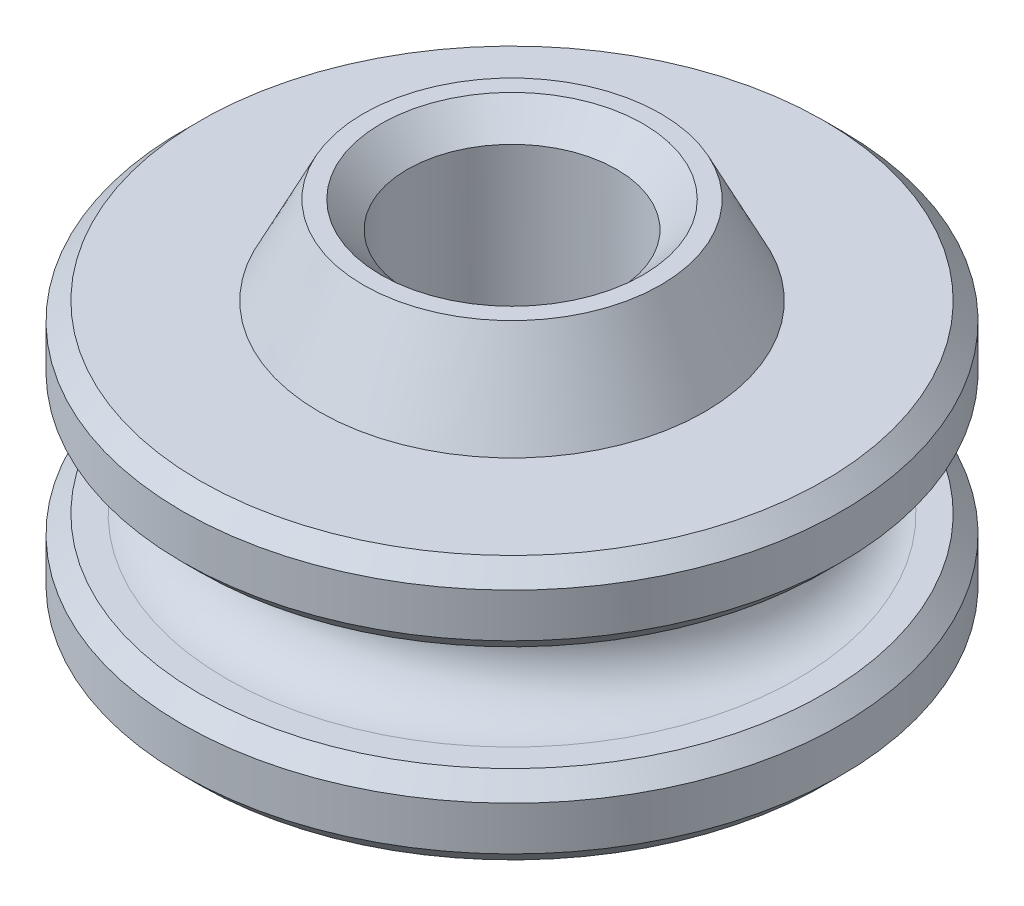
ISO-10303-21;
HEADER;
FILE_DESCRIPTION(('STEP AP214'),'2;1');
FILE_NAME('part.step','',(''),(''),'','','');
FILE_SCHEMA(('AUTOMOTIVE_DESIGN { 1 0 10303 214 1 1 1 1 }'));
ENDSEC;
DATA;
#1=APPLICATION_CONTEXT('core data for automotive mechanical design processes');
#2=APPLICATION_PROTOCOL_DEFINITION('international standard','automotive_design',2000,#1);
#3=PRODUCT_CONTEXT('',#1,'mechanical');
#4=PRODUCT('Part','Part','',(#3));
#5=PRODUCT_RELATED_PRODUCT_CATEGORY('part','',(#4));
#6=PRODUCT_DEFINITION_FORMATION('','',#4);
#7=PRODUCT_DEFINITION_CONTEXT('part definition',#1,'design');
#8=PRODUCT_DEFINITION('design','',#6,#7);
#9=PRODUCT_DEFINITION_SHAPE('','',#8);
#10=(LENGTH_UNIT() NAMED_UNIT(*) SI_UNIT(.MILLI.,.METRE.));
#11=(NAMED_UNIT(*) PLANE_ANGLE_UNIT() SI_UNIT($,.RADIAN.));
#12=(NAMED_UNIT(*) SI_UNIT($,.STERADIAN.) SOLID_ANGLE_UNIT());
#13=UNCERTAINTY_MEASURE_WITH_UNIT(LENGTH_MEASURE(1.E-05),#10,'distance_accuracy_value','');
#14=(GEOMETRIC_REPRESENTATION_CONTEXT(3) GLOBAL_UNCERTAINTY_ASSIGNED_CONTEXT((#13)) GLOBAL_UNIT_ASSIGNED_CONTEXT((#10,
#11,#12)) REPRESENTATION_CONTEXT('',''));
#15=CARTESIAN_POINT('',(0.,0.,0.));
#16=DIRECTION('',(0.,0.,1.));
#17=DIRECTION('',(1.,0.,0.));
#18=AXIS2_PLACEMENT_3D('',#15,#16,#17);
#19=CARTESIAN_POINT('',(0.,0.,0.));
#20=DIRECTION('',(0.,1.,0.));
#21=DIRECTION('',(0.,0.,1.));
#22=AXIS2_PLACEMENT_3D('',#19,#20,#21);
#23=TOROIDAL_SURFACE('',#22,3.25,0.6);
#24=CARTESIAN_POINT('',(0.,0.6,0.));
#25=DIRECTION('',(0.,1.,0.));
#26=DIRECTION('',(0.,0.,1.));
#27=AXIS2_PLACEMENT_3D('',#24,#25,#26);
#28=CIRCLE('',#27,3.25);
#29=CARTESIAN_POINT('',(0.,0.6,3.25));
#30=VERTEX_POINT('',#29);
#31=EDGE_CURVE('E78',#30,#30,#28,.T.);
#32=ORIENTED_EDGE('',*,*,#31,.F.);
#33=EDGE_LOOP('',(#32));
#34=FACE_BOUND('',#33,.T.);
#35=CARTESIAN_POINT('',(0.,-0.6,0.));
#36=DIRECTION('',(0.,1.,0.));
#37=DIRECTION('',(0.,0.,1.));
#38=AXIS2_PLACEMENT_3D('',#35,#36,#37);
#39=CIRCLE('',#38,3.25);
#40=CARTESIAN_POINT('',(0.,-0.6,3.25));
#41=VERTEX_POINT('',#40);
#42=EDGE_CURVE('E87',#41,#41,#39,.T.);
#43=ORIENTED_EDGE('',*,*,#42,.T.);
#44=EDGE_LOOP('',(#43));
#45=FACE_BOUND('',#44,.T.);
#46=ADVANCED_FACE('F34',(#34,#45),#23,.F.);
#47=CARTESIAN_POINT('',(0.,0.6,-3.25));
#48=DIRECTION('',(0.,1.,0.));
#49=DIRECTION('',(0.,0.,1.));
#50=AXIS2_PLACEMENT_3D('',#47,#48,#49);
#51=PLANE('',#50);
#52=CARTESIAN_POINT('',(0.,0.6,0.));
#53=DIRECTION('',(0.,1.,0.));
#54=DIRECTION('',(0.,0.,1.));
#55=AXIS2_PLACEMENT_3D('',#52,#53,#54);
#56=CIRCLE('',#55,3.55);
#57=CARTESIAN_POINT('',(0.,0.6,3.55));
#58=VERTEX_POINT('',#57);
#59=EDGE_CURVE('E45',#58,#58,#56,.F.);
#60=ORIENTED_EDGE('',*,*,#59,.T.);
#61=EDGE_LOOP('',(#60));
#62=FACE_BOUND('',#61,.T.);
#63=ORIENTED_EDGE('',*,*,#31,.T.);
#64=EDGE_LOOP('',(#63));
#65=FACE_BOUND('',#64,.T.);
#66=ADVANCED_FACE('F109',(#62,#65),#51,.F.);
#67=CARTESIAN_POINT('',(0.,2.7,0.));
#68=DIRECTION('',(0.,1.,0.));
#69=DIRECTION('',(0.,0.,1.));
#70=AXIS2_PLACEMENT_3D('',#67,#68,#69);
#71=CYLINDRICAL_SURFACE('',#70,3.75);
#72=CARTESIAN_POINT('',(0.,0.8,0.));
#73=DIRECTION('',(0.,1.,0.));
#74=DIRECTION('',(0.,0.,1.));
#75=AXIS2_PLACEMENT_3D('',#72,#73,#74);
#76=CIRCLE('',#75,3.75);
#77=CARTESIAN_POINT('',(0.,0.8,3.75));
#78=VERTEX_POINT('',#77);
#79=EDGE_CURVE('E49',#78,#78,#76,.T.);
#80=ORIENTED_EDGE('',*,*,#79,.T.);
#81=EDGE_LOOP('',(#80));
#82=FACE_BOUND('',#81,.T.);
#83=CARTESIAN_POINT('',(0.,1.3,0.));
#84=DIRECTION('',(0.,-1.,0.));
#85=DIRECTION('',(0.,0.,-1.));
#86=AXIS2_PLACEMENT_3D('',#83,#84,#85);
#87=CIRCLE('',#86,3.75);
#88=CARTESIAN_POINT('',(0.,1.3,-3.75));
#89=VERTEX_POINT('',#88);
#90=EDGE_CURVE('E54',#89,#89,#87,.T.);
#91=ORIENTED_EDGE('',*,*,#90,.T.);
#92=EDGE_LOOP('',(#91));
#93=FACE_BOUND('',#92,.T.);
#94=ADVANCED_FACE('F115',(#82,#93),#71,.T.);
#95=CARTESIAN_POINT('',(0.,1.5,-2.191));
#96=DIRECTION('',(0.,-1.,0.));
#97=DIRECTION('',(0.,0.,-1.));
#98=AXIS2_PLACEMENT_3D('',#95,#96,#97);
#99=PLANE('',#98);
#100=CARTESIAN_POINT('',(0.,1.5,0.));
#101=DIRECTION('',(0.,-1.,0.));
#102=DIRECTION('',(0.,0.,-1.));
#103=AXIS2_PLACEMENT_3D('',#100,#101,#102);
#104=CIRCLE('',#103,3.55);
#105=CARTESIAN_POINT('',(0.,1.5,-3.55));
#106=VERTEX_POINT('',#105);
#107=EDGE_CURVE('E41',#106,#106,#104,.F.);
#108=ORIENTED_EDGE('',*,*,#107,.T.);
#109=EDGE_LOOP('',(#108));
#110=FACE_BOUND('',#109,.T.);
#111=CARTESIAN_POINT('',(0.,1.5,0.));
#112=DIRECTION('',(0.,1.,0.));
#113=DIRECTION('',(0.,0.,1.));
#114=AXIS2_PLACEMENT_3D('',#111,#112,#113);
#115=CIRCLE('',#114,2.191);
#116=CARTESIAN_POINT('',(0.,1.5,2.191));
#117=VERTEX_POINT('',#116);
#118=EDGE_CURVE('E81',#117,#117,#115,.T.);
#119=ORIENTED_EDGE('',*,*,#118,.F.);
#120=EDGE_LOOP('',(#119));
#121=FACE_BOUND('',#120,.T.);
#122=ADVANCED_FACE('F142',(#110,#121),#99,.F.);
#123=CARTESIAN_POINT('',(0.,1.5,0.));
#124=DIRECTION('',(0.,-1.,0.));
#125=DIRECTION('',(0.,0.,-1.));
#126=AXIS2_PLACEMENT_3D('',#123,#124,#125);
#127=CONICAL_SURFACE('',#126,2.191,0.463647609000807);
#128=CARTESIAN_POINT('',(0.,2.5,0.));
#129=DIRECTION('',(0.,1.,0.));
#130=DIRECTION('',(0.,0.,1.));
#131=AXIS2_PLACEMENT_3D('',#128,#129,#130);
#132=CIRCLE('',#131,1.691);
#133=CARTESIAN_POINT('',(0.,2.5,1.691));
#134=VERTEX_POINT('',#133);
#135=EDGE_CURVE('E84',#134,#134,#132,.T.);
#136=ORIENTED_EDGE('',*,*,#135,.F.);
#137=EDGE_LOOP('',(#136));
#138=FACE_BOUND('',#137,.T.);
#139=ORIENTED_EDGE('',*,*,#118,.T.);
#140=EDGE_LOOP('',(#139));
#141=FACE_BOUND('',#140,.T.);
#142=ADVANCED_FACE('F147',(#138,#141),#127,.T.);
#143=CARTESIAN_POINT('',(0.,2.5,-1.191));
#144=DIRECTION('',(0.,-1.,0.));
#145=DIRECTION('',(0.,0.,-1.));
#146=AXIS2_PLACEMENT_3D('',#143,#144,#145);
#147=PLANE('',#146);
#148=CARTESIAN_POINT('',(0.,2.5,0.));
#149=DIRECTION('',(0.,-1.,0.));
#150=DIRECTION('',(0.,0.,-1.));
#151=AXIS2_PLACEMENT_3D('',#148,#149,#150);
#152=CIRCLE('',#151,1.491);
#153=CARTESIAN_POINT('',(0.,2.5,-1.491));
#154=VERTEX_POINT('',#153);
#155=EDGE_CURVE('E69',#154,#154,#152,.T.);
#156=ORIENTED_EDGE('',*,*,#155,.T.);
#157=EDGE_LOOP('',(#156));
#158=FACE_BOUND('',#157,.T.);
#159=ORIENTED_EDGE('',*,*,#135,.T.);
#160=EDGE_LOOP('',(#159));
#161=FACE_BOUND('',#160,.T.);
#162=ADVANCED_FACE('F152',(#158,#161),#147,.F.);
#163=CARTESIAN_POINT('',(0.,2.7,0.));
#164=DIRECTION('',(0.,1.,0.));
#165=DIRECTION('',(0.,0.,1.));
#166=AXIS2_PLACEMENT_3D('',#163,#164,#165);
#167=CYLINDRICAL_SURFACE('',#166,1.191);
#168=CARTESIAN_POINT('',(0.,2.2,0.));
#169=DIRECTION('',(0.,-1.,0.));
#170=DIRECTION('',(0.,0.,-1.));
#171=AXIS2_PLACEMENT_3D('',#168,#169,#170);
#172=CIRCLE('',#171,1.191);
#173=CARTESIAN_POINT('',(0.,2.2,-1.191));
#174=VERTEX_POINT('',#173);
#175=EDGE_CURVE('E72',#174,#174,#172,.F.);
#176=ORIENTED_EDGE('',*,*,#175,.T.);
#177=EDGE_LOOP('',(#176));
#178=FACE_BOUND('',#177,.T.);
#179=CARTESIAN_POINT('',(0.,-1.2,0.));
#180=DIRECTION('',(0.,1.,0.));
#181=DIRECTION('',(0.,0.,1.));
#182=AXIS2_PLACEMENT_3D('',#179,#180,#181);
#183=CIRCLE('',#182,1.191);
#184=CARTESIAN_POINT('',(0.,-1.2,1.191));
#185=VERTEX_POINT('',#184);
#186=EDGE_CURVE('E75',#185,#185,#183,.F.);
#187=ORIENTED_EDGE('',*,*,#186,.T.);
#188=EDGE_LOOP('',(#187));
#189=FACE_BOUND('',#188,.T.);
#190=ADVANCED_FACE('F156',(#178,#189),#167,.F.);
#191=CARTESIAN_POINT('',(0.,-1.5,-2.191));
#192=DIRECTION('',(0.,1.,0.));
#193=DIRECTION('',(0.,0.,1.));
#194=AXIS2_PLACEMENT_3D('',#191,#192,#193);
#195=PLANE('',#194);
#196=CARTESIAN_POINT('',(0.,-1.5,0.));
#197=DIRECTION('',(0.,1.,0.));
#198=DIRECTION('',(0.,0.,1.));
#199=AXIS2_PLACEMENT_3D('',#196,#197,#198);
#200=CIRCLE('',#199,3.55);
#201=CARTESIAN_POINT('',(0.,-1.5,3.55));
#202=VERTEX_POINT('',#201);
#203=EDGE_CURVE('E10',#202,#202,#200,.F.);
#204=ORIENTED_EDGE('',*,*,#203,.T.);
#205=EDGE_LOOP('',(#204));
#206=FACE_BOUND('',#205,.T.);
#207=CARTESIAN_POINT('',(0.,-1.5,0.));
#208=DIRECTION('',(0.,1.,0.));
#209=DIRECTION('',(0.,0.,1.));
#210=AXIS2_PLACEMENT_3D('',#207,#208,#209);
#211=CIRCLE('',#210,1.491);
#212=CARTESIAN_POINT('',(0.,-1.5,1.491));
#213=VERTEX_POINT('',#212);
#214=EDGE_CURVE('E66',#213,#213,#211,.T.);
#215=ORIENTED_EDGE('',*,*,#214,.T.);
#216=EDGE_LOOP('',(#215));
#217=FACE_BOUND('',#216,.T.);
#218=ADVANCED_FACE('F105',(#206,#217),#195,.F.);
#219=CARTESIAN_POINT('',(0.,2.7,0.));
#220=DIRECTION('',(0.,1.,0.));
#221=DIRECTION('',(0.,0.,1.));
#222=AXIS2_PLACEMENT_3D('',#219,#220,#221);
#223=CYLINDRICAL_SURFACE('',#222,3.75);
#224=CARTESIAN_POINT('',(0.,-0.799999999999999,0.));
#225=DIRECTION('',(0.,-1.,0.));
#226=DIRECTION('',(0.,0.,-1.));
#227=AXIS2_PLACEMENT_3D('',#224,#225,#226);
#228=CIRCLE('',#227,3.75);
#229=CARTESIAN_POINT('',(0.,-0.799999999999999,-3.75));
#230=VERTEX_POINT('',#229);
#231=EDGE_CURVE('E57',#230,#230,#228,.T.);
#232=ORIENTED_EDGE('',*,*,#231,.T.);
#233=EDGE_LOOP('',(#232));
#234=FACE_BOUND('',#233,.T.);
#235=CARTESIAN_POINT('',(0.,-1.3,0.));
#236=DIRECTION('',(0.,1.,0.));
#237=DIRECTION('',(0.,0.,1.));
#238=AXIS2_PLACEMENT_3D('',#235,#236,#237);
#239=CIRCLE('',#238,3.75);
#240=CARTESIAN_POINT('',(0.,-1.3,3.75));
#241=VERTEX_POINT('',#240);
#242=EDGE_CURVE('E60',#241,#241,#239,.T.);
#243=ORIENTED_EDGE('',*,*,#242,.T.);
#244=EDGE_LOOP('',(#243));
#245=FACE_BOUND('',#244,.T.);
#246=ADVANCED_FACE('F95',(#234,#245),#223,.T.);
#247=CARTESIAN_POINT('',(0.,-0.6,-3.25));
#248=DIRECTION('',(0.,-1.,0.));
#249=DIRECTION('',(0.,0.,-1.));
#250=AXIS2_PLACEMENT_3D('',#247,#248,#249);
#251=PLANE('',#250);
#252=CARTESIAN_POINT('',(0.,-0.6,0.));
#253=DIRECTION('',(0.,-1.,0.));
#254=DIRECTION('',(0.,0.,-1.));
#255=AXIS2_PLACEMENT_3D('',#252,#253,#254);
#256=CIRCLE('',#255,3.55);
#257=CARTESIAN_POINT('',(0.,-0.6,-3.55));
#258=VERTEX_POINT('',#257);
#259=EDGE_CURVE('E63',#258,#258,#256,.F.);
#260=ORIENTED_EDGE('',*,*,#259,.T.);
#261=EDGE_LOOP('',(#260));
#262=FACE_BOUND('',#261,.T.);
#263=ORIENTED_EDGE('',*,*,#42,.F.);
#264=EDGE_LOOP('',(#263));
#265=FACE_BOUND('',#264,.T.);
#266=ADVANCED_FACE('F92',(#262,#265),#251,.F.);
#267=CARTESIAN_POINT('',(0.,2.2,0.));
#268=DIRECTION('',(0.,1.,0.));
#269=DIRECTION('',(0.,0.,1.));
#270=AXIS2_PLACEMENT_3D('',#267,#268,#269);
#271=CONICAL_SURFACE('',#270,1.191,0.78539816339745);
#272=ORIENTED_EDGE('',*,*,#155,.F.);
#273=EDGE_LOOP('',(#272));
#274=FACE_BOUND('',#273,.T.);
#275=ORIENTED_EDGE('',*,*,#175,.F.);
#276=EDGE_LOOP('',(#275));
#277=FACE_BOUND('',#276,.T.);
#278=ADVANCED_FACE('F94',(#274,#277),#271,.F.);
#279=CARTESIAN_POINT('',(0.,-1.5,0.));
#280=DIRECTION('',(0.,-1.,0.));
#281=DIRECTION('',(0.,0.,-1.));
#282=AXIS2_PLACEMENT_3D('',#279,#280,#281);
#283=CONICAL_SURFACE('',#282,1.491,0.785398163397446);
#284=ORIENTED_EDGE('',*,*,#186,.F.);
#285=EDGE_LOOP('',(#284));
#286=FACE_BOUND('',#285,.T.);
#287=ORIENTED_EDGE('',*,*,#214,.F.);
#288=EDGE_LOOP('',(#287));
#289=FACE_BOUND('',#288,.T.);
#290=ADVANCED_FACE('F102',(#286,#289),#283,.F.);
#291=CARTESIAN_POINT('',(0.,-0.6,0.));
#292=DIRECTION('',(0.,-1.,0.));
#293=DIRECTION('',(0.,0.,-1.));
#294=AXIS2_PLACEMENT_3D('',#291,#292,#293);
#295=CONICAL_SURFACE('',#294,3.55,0.785398163397446);
#296=CARTESIAN_POINT('',(0.,-0.799999999999999,-3.75));
#297=CARTESIAN_POINT('',(0.,-0.797916666666666,-3.74791666666667));
#298=CARTESIAN_POINT('',(0.,-0.795833333333333,-3.74583333333333));
#299=CARTESIAN_POINT('',(0.,-0.791666666666666,-3.74166666666667));
#300=CARTESIAN_POINT('',(0.,-0.789583333333333,-3.73958333333333));
#301=CARTESIAN_POINT('',(0.,-0.785416666666666,-3.73541666666667));
#302=CARTESIAN_POINT('',(0.,-0.783333333333333,-3.73333333333333));
#303=CARTESIAN_POINT('',(0.,-0.779166666666666,-3.72916666666667));
#304=CARTESIAN_POINT('',(0.,-0.777083333333333,-3.72708333333333));
#305=CARTESIAN_POINT('',(0.,-0.772916666666666,-3.72291666666667));
#306=CARTESIAN_POINT('',(0.,-0.770833333333333,-3.72083333333333));
#307=CARTESIAN_POINT('',(0.,-0.766666666666666,-3.71666666666667));
#308=CARTESIAN_POINT('',(0.,-0.764583333333333,-3.71458333333333));
#309=CARTESIAN_POINT('',(0.,-0.760416666666666,-3.71041666666667));
#310=CARTESIAN_POINT('',(0.,-0.758333333333333,-3.70833333333333));
#311=CARTESIAN_POINT('',(0.,-0.754166666666666,-3.70416666666667));
#312=CARTESIAN_POINT('',(0.,-0.752083333333333,-3.70208333333333));
#313=CARTESIAN_POINT('',(0.,-0.747916666666666,-3.69791666666667));
#314=CARTESIAN_POINT('',(0.,-0.745833333333333,-3.69583333333333));
#315=CARTESIAN_POINT('',(0.,-0.741666666666666,-3.69166666666667));
#316=CARTESIAN_POINT('',(0.,-0.739583333333333,-3.68958333333333));
#317=CARTESIAN_POINT('',(0.,-0.735416666666666,-3.68541666666667));
#318=CARTESIAN_POINT('',(0.,-0.733333333333333,-3.68333333333333));
#319=CARTESIAN_POINT('',(0.,-0.729166666666666,-3.67916666666667));
#320=CARTESIAN_POINT('',(0.,-0.727083333333333,-3.67708333333333));
#321=CARTESIAN_POINT('',(0.,-0.722916666666666,-3.67291666666667));
#322=CARTESIAN_POINT('',(0.,-0.720833333333333,-3.67083333333333));
#323=CARTESIAN_POINT('',(0.,-0.716666666666666,-3.66666666666667));
#324=CARTESIAN_POINT('',(0.,-0.714583333333333,-3.66458333333333));
#325=CARTESIAN_POINT('',(0.,-0.710416666666666,-3.66041666666667));
#326=CARTESIAN_POINT('',(0.,-0.708333333333333,-3.65833333333333));
#327=CARTESIAN_POINT('',(0.,-0.704166666666666,-3.65416666666667));
#328=CARTESIAN_POINT('',(0.,-0.702083333333333,-3.65208333333333));
#329=CARTESIAN_POINT('',(0.,-0.697916666666666,-3.64791666666667));
#330=CARTESIAN_POINT('',(0.,-0.695833333333333,-3.64583333333333));
#331=CARTESIAN_POINT('',(0.,-0.691666666666666,-3.64166666666667));
#332=CARTESIAN_POINT('',(0.,-0.689583333333333,-3.63958333333333));
#333=CARTESIAN_POINT('',(0.,-0.685416666666666,-3.63541666666667));
#334=CARTESIAN_POINT('',(0.,-0.683333333333333,-3.63333333333333));
#335=CARTESIAN_POINT('',(0.,-0.679166666666666,-3.62916666666667));
#336=CARTESIAN_POINT('',(0.,-0.677083333333333,-3.62708333333333));
#337=CARTESIAN_POINT('',(0.,-0.672916666666666,-3.62291666666667));
#338=CARTESIAN_POINT('',(0.,-0.670833333333333,-3.62083333333333));
#339=CARTESIAN_POINT('',(0.,-0.666666666666666,-3.61666666666667));
#340=CARTESIAN_POINT('',(0.,-0.664583333333333,-3.61458333333333));
#341=CARTESIAN_POINT('',(0.,-0.660416666666666,-3.61041666666667));
#342=CARTESIAN_POINT('',(0.,-0.658333333333333,-3.60833333333333));
#343=CARTESIAN_POINT('',(0.,-0.654166666666666,-3.60416666666667));
#344=CARTESIAN_POINT('',(0.,-0.652083333333333,-3.60208333333333));
#345=CARTESIAN_POINT('',(0.,-0.647916666666666,-3.59791666666667));
#346=CARTESIAN_POINT('',(0.,-0.645833333333333,-3.59583333333333));
#347=CARTESIAN_POINT('',(0.,-0.641666666666666,-3.59166666666667));
#348=CARTESIAN_POINT('',(0.,-0.639583333333333,-3.58958333333333));
#349=CARTESIAN_POINT('',(0.,-0.635416666666667,-3.58541666666667));
#350=CARTESIAN_POINT('',(0.,-0.633333333333333,-3.58333333333333));
#351=CARTESIAN_POINT('',(0.,-0.629166666666666,-3.57916666666667));
#352=CARTESIAN_POINT('',(0.,-0.627083333333333,-3.57708333333333));
#353=CARTESIAN_POINT('',(0.,-0.622916666666666,-3.57291666666667));
#354=CARTESIAN_POINT('',(0.,-0.620833333333333,-3.57083333333333));
#355=CARTESIAN_POINT('',(0.,-0.616666666666666,-3.56666666666667));
#356=CARTESIAN_POINT('',(0.,-0.614583333333333,-3.56458333333333));
#357=CARTESIAN_POINT('',(0.,-0.610416666666666,-3.56041666666667));
#358=CARTESIAN_POINT('',(0.,-0.608333333333333,-3.55833333333333));
#359=CARTESIAN_POINT('',(0.,-0.604166666666667,-3.55416666666667));
#360=CARTESIAN_POINT('',(0.,-0.602083333333333,-3.55208333333333));
#361=CARTESIAN_POINT('',(0.,-0.6,-3.55));
#362=B_SPLINE_CURVE_WITH_KNOTS('',3,(#296,#297,#298,#299,#300,#301,#302,#303,#304,#305,#306,
#307,#308,#309,#310,#311,#312,#313,#314,#315,#316,#317,#318,#319,#320,#321,#322,#323,#324,#325,
#326,#327,#328,#329,#330,#331,#332,#333,#334,#335,#336,#337,#338,#339,#340,#341,#342,#343,#344,
#345,#346,#347,#348,#349,#350,#351,#352,#353,#354,#355,#356,#357,#358,#359,#360,#361),
.UNSPECIFIED.,.F.,.F.,(4,2,2,2,2,2,2,2,2,2,2,2,2,2,2,2,2,2,2,2,2,2,2,2,2,2,2,2,2,2,2,2,4),(0.,
0.00883883476483194,0.0176776695296636,0.0265165042944956,0.0353553390593272,0.0441941738241592,
0.0530330085889908,0.0618718433538228,0.0707106781186544,0.0795495128834864,0.0883883476483181,
0.09722718241315,0.106066017177982,0.114904851942814,0.123743686707645,0.132582521472477,
0.141421356237309,0.150260191002141,0.159099025766973,0.167937860531804,0.176776695296636,
0.185615530061468,0.1944543648263,0.203293199591131,0.212132034355963,0.220970869120795,
0.229809703885627,0.238648538650459,0.247487373415291,0.256326208180122,0.265165042944954,
0.274003877709786,0.282842712474618),.UNSPECIFIED.);
#363=EDGE_CURVE('BSEAM123',#230,#258,#362,.T.);
#364=ORIENTED_EDGE('',*,*,#231,.F.);
#365=ORIENTED_EDGE('',*,*,#259,.F.);
#366=ORIENTED_EDGE('',*,*,#363,.T.);
#367=ORIENTED_EDGE('',*,*,#363,.F.);
#368=EDGE_LOOP('',(#364,#366,#365,#367));
#369=FACE_BOUND('',#368,.T.);
#370=ADVANCED_FACE('F123',(#369),#295,.T.);
#371=CARTESIAN_POINT('',(0.,0.8,0.));
#372=DIRECTION('',(0.,1.,0.));
#373=DIRECTION('',(0.,0.,1.));
#374=AXIS2_PLACEMENT_3D('',#371,#372,#373);
#375=CONICAL_SURFACE('',#374,3.75,0.785398163397449);
#376=ORIENTED_EDGE('',*,*,#59,.F.);
#377=EDGE_LOOP('',(#376));
#378=FACE_BOUND('',#377,.T.);
#379=ORIENTED_EDGE('',*,*,#79,.F.);
#380=EDGE_LOOP('',(#379));
#381=FACE_BOUND('',#380,.T.);
#382=ADVANCED_FACE('F127',(#378,#381),#375,.T.);
#383=CARTESIAN_POINT('',(0.,1.5,0.));
#384=DIRECTION('',(0.,-1.,0.));
#385=DIRECTION('',(0.,0.,-1.));
#386=AXIS2_PLACEMENT_3D('',#383,#384,#385);
#387=CONICAL_SURFACE('',#386,3.55,0.785398163397446);
#388=ORIENTED_EDGE('',*,*,#90,.F.);
#389=EDGE_LOOP('',(#388));
#390=FACE_BOUND('',#389,.T.);
#391=ORIENTED_EDGE('',*,*,#107,.F.);
#392=EDGE_LOOP('',(#391));
#393=FACE_BOUND('',#392,.T.);
#394=ADVANCED_FACE('F130',(#390,#393),#387,.T.);
#395=CARTESIAN_POINT('',(0.,-1.3,0.));
#396=DIRECTION('',(0.,1.,0.));
#397=DIRECTION('',(0.,0.,1.));
#398=AXIS2_PLACEMENT_3D('',#395,#396,#397);
#399=CONICAL_SURFACE('',#398,3.75,0.785398163397445);
#400=ORIENTED_EDGE('',*,*,#203,.F.);
#401=EDGE_LOOP('',(#400));
#402=FACE_BOUND('',#401,.T.);
#403=ORIENTED_EDGE('',*,*,#242,.F.);
#404=EDGE_LOOP('',(#403));
#405=FACE_BOUND('',#404,.T.);
#406=ADVANCED_FACE('F36',(#402,#405),#399,.T.);
#407=CLOSED_SHELL('',(#46,#66,#94,#122,#142,#162,#190,#218,#246,#266,#278,#290,#370,#382,#394,#406));
#408=MANIFOLD_SOLID_BREP('B2',#407);
#409=ADVANCED_BREP_SHAPE_REPRESENTATION('',(#18,#408),#14);
#410=SHAPE_DEFINITION_REPRESENTATION(#9,#409);
ENDSEC;
END-ISO-10303-21;
